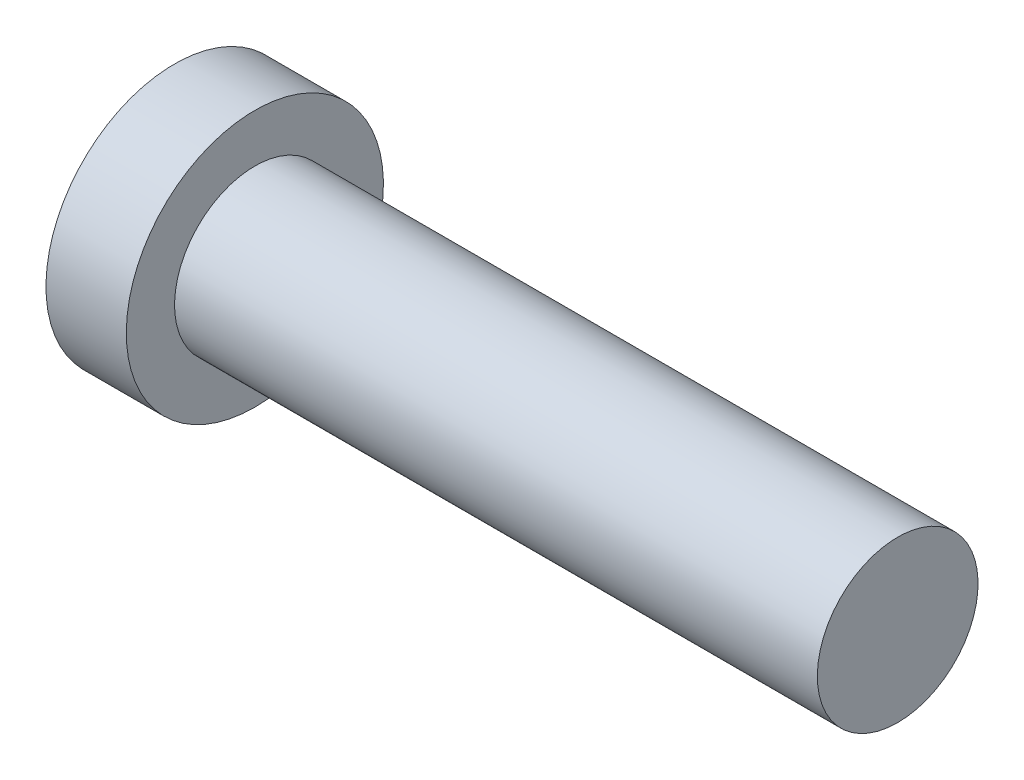
ISO-10303-21;
HEADER;
FILE_DESCRIPTION(('STEP AP214'),'2;1');
FILE_NAME('part.step','',(''),(''),'','','');
FILE_SCHEMA(('AUTOMOTIVE_DESIGN { 1 0 10303 214 1 1 1 1 }'));
ENDSEC;
DATA;
#1=APPLICATION_CONTEXT('core data for automotive mechanical design processes');
#2=APPLICATION_PROTOCOL_DEFINITION('international standard','automotive_design',2000,#1);
#3=PRODUCT_CONTEXT('',#1,'mechanical');
#4=PRODUCT('Part','Part','',(#3));
#5=PRODUCT_RELATED_PRODUCT_CATEGORY('part','',(#4));
#6=PRODUCT_DEFINITION_FORMATION('','',#4);
#7=PRODUCT_DEFINITION_CONTEXT('part definition',#1,'design');
#8=PRODUCT_DEFINITION('design','',#6,#7);
#9=PRODUCT_DEFINITION_SHAPE('','',#8);
#10=(LENGTH_UNIT() NAMED_UNIT(*) SI_UNIT(.MILLI.,.METRE.));
#11=(NAMED_UNIT(*) PLANE_ANGLE_UNIT() SI_UNIT($,.RADIAN.));
#12=(NAMED_UNIT(*) SI_UNIT($,.STERADIAN.) SOLID_ANGLE_UNIT());
#13=UNCERTAINTY_MEASURE_WITH_UNIT(LENGTH_MEASURE(1.E-05),#10,'distance_accuracy_value','');
#14=(GEOMETRIC_REPRESENTATION_CONTEXT(3) GLOBAL_UNCERTAINTY_ASSIGNED_CONTEXT((#13)) GLOBAL_UNIT_ASSIGNED_CONTEXT((#10,
#11,#12)) REPRESENTATION_CONTEXT('',''));
#15=CARTESIAN_POINT('',(0.,0.,0.));
#16=DIRECTION('',(0.,0.,1.));
#17=DIRECTION('',(1.,0.,0.));
#18=AXIS2_PLACEMENT_3D('',#15,#16,#17);
#19=CARTESIAN_POINT('',(0.,0.,0.));
#20=DIRECTION('',(-1.,0.,0.));
#21=DIRECTION('',(0.,-1.,0.));
#22=AXIS2_PLACEMENT_3D('',#19,#20,#21);
#23=PLANE('',#22);
#24=CARTESIAN_POINT('',(0.,0.,0.));
#25=DIRECTION('',(-1.,0.,0.));
#26=DIRECTION('',(0.,-1.,0.));
#27=AXIS2_PLACEMENT_3D('',#24,#25,#26);
#28=CIRCLE('',#27,0.25);
#29=CARTESIAN_POINT('',(0.,-0.25,0.));
#30=VERTEX_POINT('',#29);
#31=EDGE_CURVE('E10',#30,#30,#28,.T.);
#32=ORIENTED_EDGE('',*,*,#31,.F.);
#33=EDGE_LOOP('',(#32));
#34=FACE_BOUND('',#33,.T.);
#35=ADVANCED_FACE('F37',(#34),#23,.F.);
#36=CARTESIAN_POINT('',(-2.25,0.,0.));
#37=DIRECTION('',(-1.,0.,0.));
#38=DIRECTION('',(0.,-1.,0.));
#39=AXIS2_PLACEMENT_3D('',#36,#37,#38);
#40=CYLINDRICAL_SURFACE('',#39,0.25);
#41=CARTESIAN_POINT('',(-2.,0.,0.));
#42=DIRECTION('',(-1.,0.,0.));
#43=DIRECTION('',(0.,-1.,0.));
#44=AXIS2_PLACEMENT_3D('',#41,#42,#43);
#45=CIRCLE('',#44,0.25);
#46=CARTESIAN_POINT('',(-2.,-0.25,0.));
#47=VERTEX_POINT('',#46);
#48=EDGE_CURVE('E44',#47,#47,#45,.T.);
#49=ORIENTED_EDGE('',*,*,#48,.F.);
#50=EDGE_LOOP('',(#49));
#51=FACE_BOUND('',#50,.T.);
#52=ORIENTED_EDGE('',*,*,#31,.T.);
#53=EDGE_LOOP('',(#52));
#54=FACE_BOUND('',#53,.T.);
#55=ADVANCED_FACE('F71',(#51,#54),#40,.T.);
#56=CARTESIAN_POINT('',(-2.,0.25,0.));
#57=DIRECTION('',(-1.,0.,0.));
#58=DIRECTION('',(0.,-1.,0.));
#59=AXIS2_PLACEMENT_3D('',#56,#57,#58);
#60=PLANE('',#59);
#61=CARTESIAN_POINT('',(-2.,0.,0.));
#62=DIRECTION('',(-1.,0.,0.));
#63=DIRECTION('',(0.,-1.,0.));
#64=AXIS2_PLACEMENT_3D('',#61,#62,#63);
#65=CIRCLE('',#64,0.4);
#66=CARTESIAN_POINT('',(-2.,-0.4,0.));
#67=VERTEX_POINT('',#66);
#68=EDGE_CURVE('E49',#67,#67,#65,.T.);
#69=ORIENTED_EDGE('',*,*,#68,.F.);
#70=EDGE_LOOP('',(#69));
#71=FACE_BOUND('',#70,.T.);
#72=ORIENTED_EDGE('',*,*,#48,.T.);
#73=EDGE_LOOP('',(#72));
#74=FACE_BOUND('',#73,.T.);
#75=ADVANCED_FACE('F66',(#71,#74),#60,.F.);
#76=CARTESIAN_POINT('',(-2.25,0.,0.));
#77=DIRECTION('',(-1.,0.,0.));
#78=DIRECTION('',(0.,-1.,0.));
#79=AXIS2_PLACEMENT_3D('',#76,#77,#78);
#80=CYLINDRICAL_SURFACE('',#79,0.4);
#81=CARTESIAN_POINT('',(-2.25,0.,0.));
#82=DIRECTION('',(-1.,0.,0.));
#83=DIRECTION('',(0.,-1.,0.));
#84=AXIS2_PLACEMENT_3D('',#81,#82,#83);
#85=CIRCLE('',#84,0.4);
#86=CARTESIAN_POINT('',(-2.25,-0.4,0.));
#87=VERTEX_POINT('',#86);
#88=EDGE_CURVE('E54',#87,#87,#85,.T.);
#89=ORIENTED_EDGE('',*,*,#88,.F.);
#90=EDGE_LOOP('',(#89));
#91=FACE_BOUND('',#90,.T.);
#92=ORIENTED_EDGE('',*,*,#68,.T.);
#93=EDGE_LOOP('',(#92));
#94=FACE_BOUND('',#93,.T.);
#95=ADVANCED_FACE('F63',(#91,#94),#80,.T.);
#96=CARTESIAN_POINT('',(-2.25,0.4,0.));
#97=DIRECTION('',(1.,0.,0.));
#98=DIRECTION('',(0.,1.,0.));
#99=AXIS2_PLACEMENT_3D('',#96,#97,#98);
#100=PLANE('',#99);
#101=ORIENTED_EDGE('',*,*,#88,.T.);
#102=EDGE_LOOP('',(#101));
#103=FACE_BOUND('',#102,.T.);
#104=ADVANCED_FACE('F61',(#103),#100,.F.);
#105=CLOSED_SHELL('',(#35,#55,#75,#95,#104));
#106=MANIFOLD_SOLID_BREP('B2',#105);
#107=ADVANCED_BREP_SHAPE_REPRESENTATION('',(#18,#106),#14);
#108=SHAPE_DEFINITION_REPRESENTATION(#9,#107);
ENDSEC;
END-ISO-10303-21;
